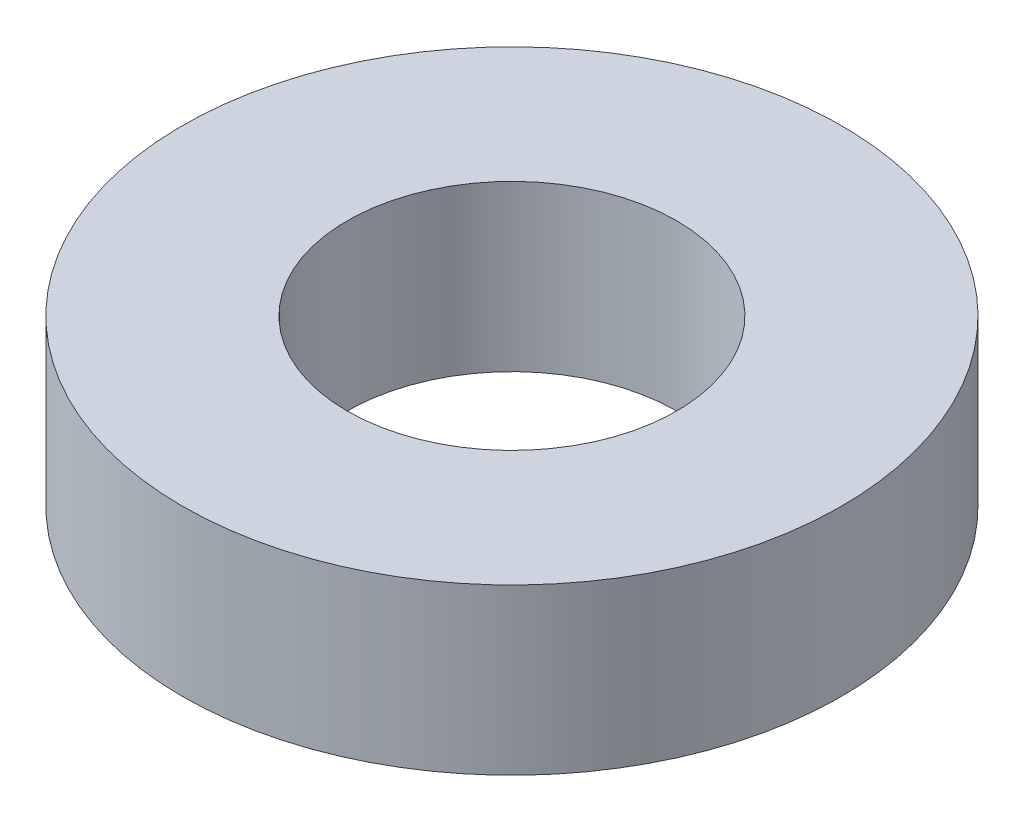
ISO-10303-21;
HEADER;
FILE_DESCRIPTION(('STEP AP214'),'2;1');
FILE_NAME('part.step','',(''),(''),'','','');
FILE_SCHEMA(('AUTOMOTIVE_DESIGN { 1 0 10303 214 1 1 1 1 }'));
ENDSEC;
DATA;
#1=APPLICATION_CONTEXT('core data for automotive mechanical design processes');
#2=APPLICATION_PROTOCOL_DEFINITION('international standard','automotive_design',2000,#1);
#3=PRODUCT_CONTEXT('',#1,'mechanical');
#4=PRODUCT('Part','Part','',(#3));
#5=PRODUCT_RELATED_PRODUCT_CATEGORY('part','',(#4));
#6=PRODUCT_DEFINITION_FORMATION('','',#4);
#7=PRODUCT_DEFINITION_CONTEXT('part definition',#1,'design');
#8=PRODUCT_DEFINITION('design','',#6,#7);
#9=PRODUCT_DEFINITION_SHAPE('','',#8);
#10=(LENGTH_UNIT() NAMED_UNIT(*) SI_UNIT(.MILLI.,.METRE.));
#11=(NAMED_UNIT(*) PLANE_ANGLE_UNIT() SI_UNIT($,.RADIAN.));
#12=(NAMED_UNIT(*) SI_UNIT($,.STERADIAN.) SOLID_ANGLE_UNIT());
#13=UNCERTAINTY_MEASURE_WITH_UNIT(LENGTH_MEASURE(1.E-05),#10,'distance_accuracy_value','');
#14=(GEOMETRIC_REPRESENTATION_CONTEXT(3) GLOBAL_UNCERTAINTY_ASSIGNED_CONTEXT((#13)) GLOBAL_UNIT_ASSIGNED_CONTEXT((#10,
#11,#12)) REPRESENTATION_CONTEXT('',''));
#15=CARTESIAN_POINT('',(0.,0.,0.));
#16=DIRECTION('',(0.,0.,1.));
#17=DIRECTION('',(1.,0.,0.));
#18=AXIS2_PLACEMENT_3D('',#15,#16,#17);
#19=CARTESIAN_POINT('',(0.,4.,0.));
#20=DIRECTION('',(0.,1.,0.));
#21=DIRECTION('',(0.,0.,1.));
#22=AXIS2_PLACEMENT_3D('',#19,#20,#21);
#23=PLANE('',#22);
#24=CARTESIAN_POINT('',(0.,4.,0.));
#25=DIRECTION('',(0.,1.,0.));
#26=DIRECTION('',(0.,0.,1.));
#27=AXIS2_PLACEMENT_3D('',#24,#25,#26);
#28=CIRCLE('',#27,8.);
#29=CARTESIAN_POINT('',(0.,4.,8.));
#30=VERTEX_POINT('',#29);
#31=EDGE_CURVE('E10',#30,#30,#28,.T.);
#32=ORIENTED_EDGE('',*,*,#31,.T.);
#33=EDGE_LOOP('',(#32));
#34=FACE_BOUND('',#33,.T.);
#35=CARTESIAN_POINT('',(0.,4.,0.));
#36=DIRECTION('',(0.,1.,0.));
#37=DIRECTION('',(0.,0.,1.));
#38=AXIS2_PLACEMENT_3D('',#35,#36,#37);
#39=CIRCLE('',#38,4.);
#40=CARTESIAN_POINT('',(0.,4.,4.));
#41=VERTEX_POINT('',#40);
#42=EDGE_CURVE('E56',#41,#41,#39,.T.);
#43=ORIENTED_EDGE('',*,*,#42,.F.);
#44=EDGE_LOOP('',(#43));
#45=FACE_BOUND('',#44,.T.);
#46=ADVANCED_FACE('F43',(#34,#45),#23,.T.);
#47=CARTESIAN_POINT('',(0.,0.,0.));
#48=DIRECTION('',(0.,1.,0.));
#49=DIRECTION('',(0.,0.,1.));
#50=AXIS2_PLACEMENT_3D('',#47,#48,#49);
#51=PLANE('',#50);
#52=CARTESIAN_POINT('',(0.,0.,0.));
#53=DIRECTION('',(0.,1.,0.));
#54=DIRECTION('',(0.,0.,1.));
#55=AXIS2_PLACEMENT_3D('',#52,#53,#54);
#56=CIRCLE('',#55,8.);
#57=CARTESIAN_POINT('',(0.,0.,8.));
#58=VERTEX_POINT('',#57);
#59=EDGE_CURVE('E47',#58,#58,#56,.T.);
#60=ORIENTED_EDGE('',*,*,#59,.F.);
#61=EDGE_LOOP('',(#60));
#62=FACE_BOUND('',#61,.T.);
#63=CARTESIAN_POINT('',(0.,0.,0.));
#64=DIRECTION('',(0.,1.,0.));
#65=DIRECTION('',(0.,0.,1.));
#66=AXIS2_PLACEMENT_3D('',#63,#64,#65);
#67=CIRCLE('',#66,4.);
#68=CARTESIAN_POINT('',(0.,0.,4.));
#69=VERTEX_POINT('',#68);
#70=EDGE_CURVE('E58',#69,#69,#67,.T.);
#71=ORIENTED_EDGE('',*,*,#70,.T.);
#72=EDGE_LOOP('',(#71));
#73=FACE_BOUND('',#72,.T.);
#74=ADVANCED_FACE('F70',(#62,#73),#51,.F.);
#75=CARTESIAN_POINT('',(0.,4.,0.));
#76=DIRECTION('',(0.,-1.,0.));
#77=DIRECTION('',(0.,0.,-1.));
#78=AXIS2_PLACEMENT_3D('',#75,#76,#77);
#79=CYLINDRICAL_SURFACE('',#78,8.);
#80=ORIENTED_EDGE('',*,*,#31,.F.);
#81=EDGE_LOOP('',(#80));
#82=FACE_BOUND('',#81,.T.);
#83=ORIENTED_EDGE('',*,*,#59,.T.);
#84=EDGE_LOOP('',(#83));
#85=FACE_BOUND('',#84,.T.);
#86=ADVANCED_FACE('F45',(#82,#85),#79,.T.);
#87=CARTESIAN_POINT('',(0.,4.,0.));
#88=DIRECTION('',(0.,-1.,0.));
#89=DIRECTION('',(0.,0.,-1.));
#90=AXIS2_PLACEMENT_3D('',#87,#88,#89);
#91=CYLINDRICAL_SURFACE('',#90,4.);
#92=ORIENTED_EDGE('',*,*,#42,.T.);
#93=EDGE_LOOP('',(#92));
#94=FACE_BOUND('',#93,.T.);
#95=ORIENTED_EDGE('',*,*,#70,.F.);
#96=EDGE_LOOP('',(#95));
#97=FACE_BOUND('',#96,.T.);
#98=ADVANCED_FACE('F66',(#94,#97),#91,.F.);
#99=CLOSED_SHELL('',(#46,#74,#86,#98));
#100=MANIFOLD_SOLID_BREP('B2',#99);
#101=ADVANCED_BREP_SHAPE_REPRESENTATION('',(#18,#100),#14);
#102=SHAPE_DEFINITION_REPRESENTATION(#9,#101);
ENDSEC;
END-ISO-10303-21;
